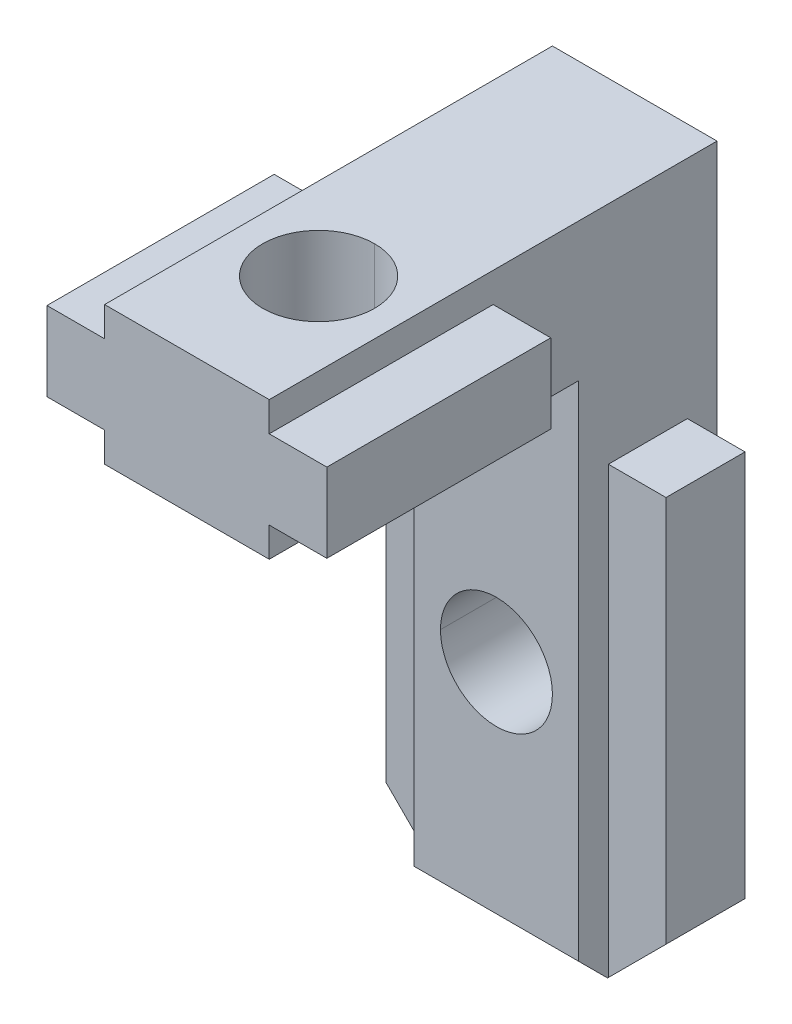
ISO-10303-21;
HEADER;
FILE_DESCRIPTION(('STEP AP214'),'2;1');
FILE_NAME('part.step','',(''),(''),'','','');
FILE_SCHEMA(('AUTOMOTIVE_DESIGN { 1 0 10303 214 1 1 1 1 }'));
ENDSEC;
DATA;
#1=APPLICATION_CONTEXT('core data for automotive mechanical design processes');
#2=APPLICATION_PROTOCOL_DEFINITION('international standard','automotive_design',2000,#1);
#3=PRODUCT_CONTEXT('',#1,'mechanical');
#4=PRODUCT('Part','Part','',(#3));
#5=PRODUCT_RELATED_PRODUCT_CATEGORY('part','',(#4));
#6=PRODUCT_DEFINITION_FORMATION('','',#4);
#7=PRODUCT_DEFINITION_CONTEXT('part definition',#1,'design');
#8=PRODUCT_DEFINITION('design','',#6,#7);
#9=PRODUCT_DEFINITION_SHAPE('','',#8);
#10=(LENGTH_UNIT() NAMED_UNIT(*) SI_UNIT(.MILLI.,.METRE.));
#11=(NAMED_UNIT(*) PLANE_ANGLE_UNIT() SI_UNIT($,.RADIAN.));
#12=(NAMED_UNIT(*) SI_UNIT($,.STERADIAN.) SOLID_ANGLE_UNIT());
#13=UNCERTAINTY_MEASURE_WITH_UNIT(LENGTH_MEASURE(1.E-05),#10,'distance_accuracy_value','');
#14=(GEOMETRIC_REPRESENTATION_CONTEXT(3) GLOBAL_UNCERTAINTY_ASSIGNED_CONTEXT((#13)) GLOBAL_UNIT_ASSIGNED_CONTEXT((#10,
#11,#12)) REPRESENTATION_CONTEXT('',''));
#15=CARTESIAN_POINT('',(0.,0.,0.));
#16=DIRECTION('',(0.,0.,1.));
#17=DIRECTION('',(1.,0.,0.));
#18=AXIS2_PLACEMENT_3D('',#15,#16,#17);
#19=CARTESIAN_POINT('',(-5.,15.,8.4));
#20=DIRECTION('',(0.,0.,1.));
#21=DIRECTION('',(1.,0.,0.));
#22=AXIS2_PLACEMENT_3D('',#19,#20,#21);
#23=CYLINDRICAL_SURFACE('',#22,3.4);
#24=DIRECTION('',(0.,0.,1.));
#25=VECTOR('',#24,1.);
#26=CARTESIAN_POINT('',(-8.4,15.,8.4));
#27=LINE('',#26,#25);
#28=CARTESIAN_POINT('',(-8.4,15.,0.));
#29=VERTEX_POINT('',#28);
#30=CARTESIAN_POINT('',(-8.4,15.,8.4));
#31=VERTEX_POINT('',#30);
#32=EDGE_CURVE('E599',#29,#31,#27,.T.);
#33=ORIENTED_EDGE('',*,*,#32,.F.);
#34=CARTESIAN_POINT('',(-5.,15.,0.));
#35=DIRECTION('',(0.,0.,1.));
#36=DIRECTION('',(1.,0.,0.));
#37=AXIS2_PLACEMENT_3D('',#34,#35,#36);
#38=CIRCLE('',#37,3.4);
#39=CARTESIAN_POINT('',(-1.6,15.,0.));
#40=VERTEX_POINT('',#39);
#41=EDGE_CURVE('E397',#40,#29,#38,.T.);
#42=ORIENTED_EDGE('',*,*,#41,.F.);
#43=DIRECTION('',(0.,0.,1.));
#44=VECTOR('',#43,1.);
#45=CARTESIAN_POINT('',(-1.6,15.,8.4));
#46=LINE('',#45,#44);
#47=CARTESIAN_POINT('',(-1.6,15.,8.4));
#48=VERTEX_POINT('',#47);
#49=EDGE_CURVE('E610',#40,#48,#46,.T.);
#50=ORIENTED_EDGE('',*,*,#49,.T.);
#51=CARTESIAN_POINT('',(-5.,15.,8.4));
#52=DIRECTION('',(0.,0.,1.));
#53=DIRECTION('',(1.,0.,0.));
#54=AXIS2_PLACEMENT_3D('',#51,#52,#53);
#55=CIRCLE('',#54,3.4);
#56=EDGE_CURVE('E398',#48,#31,#55,.T.);
#57=ORIENTED_EDGE('',*,*,#56,.T.);
#58=EDGE_LOOP('',(#33,#42,#50,#57));
#59=FACE_BOUND('',#58,.T.);
#60=ADVANCED_FACE('F17',(#59),#23,.F.);
#61=CARTESIAN_POINT('',(-5.,32.3,19.2));
#62=DIRECTION('',(0.,-1.,0.));
#63=DIRECTION('',(0.,0.,-1.));
#64=AXIS2_PLACEMENT_3D('',#61,#62,#63);
#65=CYLINDRICAL_SURFACE('',#64,3.4);
#66=DIRECTION('',(0.,-1.,0.));
#67=VECTOR('',#66,1.);
#68=CARTESIAN_POINT('',(-5.,32.3,22.6));
#69=LINE('',#68,#67);
#70=CARTESIAN_POINT('',(-5.,40.7,22.6));
#71=VERTEX_POINT('',#70);
#72=CARTESIAN_POINT('',(-5.,32.3,22.6));
#73=VERTEX_POINT('',#72);
#74=EDGE_CURVE('E598',#71,#73,#69,.T.);
#75=ORIENTED_EDGE('',*,*,#74,.F.);
#76=CARTESIAN_POINT('',(-5.,40.7,19.2));
#77=DIRECTION('',(0.,-1.,0.));
#78=DIRECTION('',(0.,0.,-1.));
#79=AXIS2_PLACEMENT_3D('',#76,#77,#78);
#80=CIRCLE('',#79,3.4);
#81=CARTESIAN_POINT('',(-5.,40.7,15.8));
#82=VERTEX_POINT('',#81);
#83=EDGE_CURVE('E379',#82,#71,#80,.T.);
#84=ORIENTED_EDGE('',*,*,#83,.F.);
#85=DIRECTION('',(0.,-1.,0.));
#86=VECTOR('',#85,1.);
#87=CARTESIAN_POINT('',(-5.,32.3,15.8));
#88=LINE('',#87,#86);
#89=CARTESIAN_POINT('',(-5.,32.3,15.8));
#90=VERTEX_POINT('',#89);
#91=EDGE_CURVE('E584',#82,#90,#88,.T.);
#92=ORIENTED_EDGE('',*,*,#91,.T.);
#93=CARTESIAN_POINT('',(-5.,32.3,19.2));
#94=DIRECTION('',(0.,-1.,0.));
#95=DIRECTION('',(0.,0.,-1.));
#96=AXIS2_PLACEMENT_3D('',#93,#94,#95);
#97=CIRCLE('',#96,3.4);
#98=EDGE_CURVE('E410',#90,#73,#97,.T.);
#99=ORIENTED_EDGE('',*,*,#98,.T.);
#100=EDGE_LOOP('',(#75,#84,#92,#99));
#101=FACE_BOUND('',#100,.T.);
#102=ADVANCED_FACE('F19',(#101),#65,.F.);
#103=CARTESIAN_POINT('',(0.,1.75,8.4));
#104=DIRECTION('',(0.,-0.707106781186549,0.707106781186546));
#105=DIRECTION('',(-1.,0.,0.));
#106=AXIS2_PLACEMENT_3D('',#103,#104,#105);
#107=PLANE('',#106);
#108=DIRECTION('',(0.,0.707106781186546,0.707106781186549));
#109=VECTOR('',#108,1.);
#110=CARTESIAN_POINT('',(-10.,1.75,8.4));
#111=LINE('',#110,#109);
#112=CARTESIAN_POINT('',(-10.,0.,6.65));
#113=VERTEX_POINT('',#112);
#114=CARTESIAN_POINT('',(-10.,1.75,8.4));
#115=VERTEX_POINT('',#114);
#116=EDGE_CURVE('E511',#113,#115,#111,.T.);
#117=ORIENTED_EDGE('',*,*,#116,.F.);
#118=DIRECTION('',(-1.,0.,0.));
#119=VECTOR('',#118,1.);
#120=CARTESIAN_POINT('',(-10.,0.,6.65));
#121=LINE('',#120,#119);
#122=CARTESIAN_POINT('',(0.,0.,6.65));
#123=VERTEX_POINT('',#122);
#124=EDGE_CURVE('E290',#123,#113,#121,.T.);
#125=ORIENTED_EDGE('',*,*,#124,.F.);
#126=DIRECTION('',(0.,-0.707106781186546,-0.707106781186549));
#127=VECTOR('',#126,1.);
#128=CARTESIAN_POINT('',(0.,1.75,8.4));
#129=LINE('',#128,#127);
#130=CARTESIAN_POINT('',(0.,1.75,8.4));
#131=VERTEX_POINT('',#130);
#132=EDGE_CURVE('E362',#131,#123,#129,.T.);
#133=ORIENTED_EDGE('',*,*,#132,.F.);
#134=DIRECTION('',(1.,0.,0.));
#135=VECTOR('',#134,1.);
#136=CARTESIAN_POINT('',(0.,1.75,8.4));
#137=LINE('',#136,#135);
#138=EDGE_CURVE('E386',#115,#131,#137,.T.);
#139=ORIENTED_EDGE('',*,*,#138,.F.);
#140=EDGE_LOOP('',(#117,#125,#133,#139));
#141=FACE_BOUND('',#140,.T.);
#142=ADVANCED_FACE('F1128',(#141),#107,.T.);
#143=CARTESIAN_POINT('',(0.,0.,1.75));
#144=DIRECTION('',(0.,0.707106781186546,0.707106781186549));
#145=DIRECTION('',(1.,0.,0.));
#146=AXIS2_PLACEMENT_3D('',#143,#144,#145);
#147=PLANE('',#146);
#148=DIRECTION('',(0.,-0.707106781186549,0.707106781186546));
#149=VECTOR('',#148,1.);
#150=CARTESIAN_POINT('',(-10.,0.,1.75));
#151=LINE('',#150,#149);
#152=CARTESIAN_POINT('',(-10.,1.75,0.));
#153=VERTEX_POINT('',#152);
#154=CARTESIAN_POINT('',(-10.,0.,1.75));
#155=VERTEX_POINT('',#154);
#156=EDGE_CURVE('E559',#153,#155,#151,.T.);
#157=ORIENTED_EDGE('',*,*,#156,.F.);
#158=DIRECTION('',(-1.,0.,0.));
#159=VECTOR('',#158,1.);
#160=CARTESIAN_POINT('',(0.,1.75,0.));
#161=LINE('',#160,#159);
#162=CARTESIAN_POINT('',(0.,1.75,0.));
#163=VERTEX_POINT('',#162);
#164=EDGE_CURVE('E394',#163,#153,#161,.T.);
#165=ORIENTED_EDGE('',*,*,#164,.F.);
#166=DIRECTION('',(0.,0.707106781186549,-0.707106781186546));
#167=VECTOR('',#166,1.);
#168=CARTESIAN_POINT('',(0.,0.,1.75));
#169=LINE('',#168,#167);
#170=CARTESIAN_POINT('',(0.,0.,1.75));
#171=VERTEX_POINT('',#170);
#172=EDGE_CURVE('E308',#171,#163,#169,.T.);
#173=ORIENTED_EDGE('',*,*,#172,.F.);
#174=DIRECTION('',(1.,0.,0.));
#175=VECTOR('',#174,1.);
#176=CARTESIAN_POINT('',(0.,0.,1.75));
#177=LINE('',#176,#175);
#178=EDGE_CURVE('E291',#155,#171,#177,.T.);
#179=ORIENTED_EDGE('',*,*,#178,.F.);
#180=EDGE_LOOP('',(#157,#165,#173,#179));
#181=FACE_BOUND('',#180,.T.);
#182=ADVANCED_FACE('F1120',(#181),#147,.F.);
#183=CARTESIAN_POINT('',(3.5,3.5,6.6));
#184=DIRECTION('',(-0.707106781186546,0.707106781186549,0.));
#185=DIRECTION('',(0.,0.,1.));
#186=AXIS2_PLACEMENT_3D('',#183,#184,#185);
#187=PLANE('',#186);
#188=DIRECTION('',(0.707106781186549,0.707106781186546,0.));
#189=VECTOR('',#188,1.);
#190=CARTESIAN_POINT('',(3.5,3.5,6.6));
#191=LINE('',#190,#189);
#192=CARTESIAN_POINT('',(0.,0.,6.6));
#193=VERTEX_POINT('',#192);
#194=CARTESIAN_POINT('',(3.5,3.5,6.6));
#195=VERTEX_POINT('',#194);
#196=EDGE_CURVE('E284',#193,#195,#191,.T.);
#197=ORIENTED_EDGE('',*,*,#196,.F.);
#198=DIRECTION('',(0.,0.,1.));
#199=VECTOR('',#198,1.);
#200=CARTESIAN_POINT('',(0.,0.,8.4));
#201=LINE('',#200,#199);
#202=CARTESIAN_POINT('',(0.,0.,1.8));
#203=VERTEX_POINT('',#202);
#204=EDGE_CURVE('E281',#203,#193,#201,.T.);
#205=ORIENTED_EDGE('',*,*,#204,.F.);
#206=DIRECTION('',(-0.707106781186549,-0.707106781186546,0.));
#207=VECTOR('',#206,1.);
#208=CARTESIAN_POINT('',(3.5,3.5,1.8));
#209=LINE('',#208,#207);
#210=CARTESIAN_POINT('',(3.5,3.5,1.8));
#211=VERTEX_POINT('',#210);
#212=EDGE_CURVE('E267',#211,#203,#209,.T.);
#213=ORIENTED_EDGE('',*,*,#212,.F.);
#214=DIRECTION('',(0.,0.,-1.));
#215=VECTOR('',#214,1.);
#216=CARTESIAN_POINT('',(3.5,3.5,6.6));
#217=LINE('',#216,#215);
#218=EDGE_CURVE('E406',#195,#211,#217,.T.);
#219=ORIENTED_EDGE('',*,*,#218,.F.);
#220=EDGE_LOOP('',(#197,#205,#213,#219));
#221=FACE_BOUND('',#220,.T.);
#222=ADVANCED_FACE('F282',(#221),#187,.F.);
#223=CARTESIAN_POINT('',(-13.5,3.5,1.8));
#224=DIRECTION('',(-0.707106781186546,-0.707106781186549,0.));
#225=DIRECTION('',(-0.707106781186549,0.707106781186546,0.));
#226=AXIS2_PLACEMENT_3D('',#223,#224,#225);
#227=PLANE('',#226);
#228=DIRECTION('',(-0.707106781186549,0.707106781186546,0.));
#229=VECTOR('',#228,1.);
#230=CARTESIAN_POINT('',(-13.5,3.5,1.8));
#231=LINE('',#230,#229);
#232=CARTESIAN_POINT('',(-10.,0.,1.8));
#233=VERTEX_POINT('',#232);
#234=CARTESIAN_POINT('',(-13.5,3.5,1.8));
#235=VERTEX_POINT('',#234);
#236=EDGE_CURVE('E366',#233,#235,#231,.T.);
#237=ORIENTED_EDGE('',*,*,#236,.F.);
#238=DIRECTION('',(0.,0.,-1.));
#239=VECTOR('',#238,1.);
#240=CARTESIAN_POINT('',(-10.,0.,1.8));
#241=LINE('',#240,#239);
#242=CARTESIAN_POINT('',(-10.,0.,6.6));
#243=VERTEX_POINT('',#242);
#244=EDGE_CURVE('E382',#243,#233,#241,.T.);
#245=ORIENTED_EDGE('',*,*,#244,.F.);
#246=DIRECTION('',(0.707106781186549,-0.707106781186546,0.));
#247=VECTOR('',#246,1.);
#248=CARTESIAN_POINT('',(-13.5,3.5,6.6));
#249=LINE('',#248,#247);
#250=CARTESIAN_POINT('',(-13.5,3.5,6.6));
#251=VERTEX_POINT('',#250);
#252=EDGE_CURVE('E473',#251,#243,#249,.T.);
#253=ORIENTED_EDGE('',*,*,#252,.F.);
#254=DIRECTION('',(0.,0.,1.));
#255=VECTOR('',#254,1.);
#256=CARTESIAN_POINT('',(-13.5,3.5,6.6));
#257=LINE('',#256,#255);
#258=EDGE_CURVE('E11',#235,#251,#257,.T.);
#259=ORIENTED_EDGE('',*,*,#258,.F.);
#260=EDGE_LOOP('',(#237,#245,#253,#259));
#261=FACE_BOUND('',#260,.T.);
#262=ADVANCED_FACE('F1097',(#261),#227,.T.);
#263=CARTESIAN_POINT('',(-13.5,0.,1.8));
#264=DIRECTION('',(-1.,0.,0.));
#265=DIRECTION('',(0.,0.,1.));
#266=AXIS2_PLACEMENT_3D('',#263,#264,#265);
#267=PLANE('',#266);
#268=DIRECTION('',(0.,-1.,0.));
#269=VECTOR('',#268,1.);
#270=CARTESIAN_POINT('',(-13.5,27.,1.8));
#271=LINE('',#270,#269);
#272=CARTESIAN_POINT('',(-13.5,27.,1.8));
#273=VERTEX_POINT('',#272);
#274=EDGE_CURVE('E399',#273,#235,#271,.T.);
#275=ORIENTED_EDGE('',*,*,#274,.T.);
#276=ORIENTED_EDGE('',*,*,#258,.T.);
#277=DIRECTION('',(0.,1.,0.));
#278=VECTOR('',#277,1.);
#279=CARTESIAN_POINT('',(-13.5,27.,6.6));
#280=LINE('',#279,#278);
#281=CARTESIAN_POINT('',(-13.5,27.,6.6));
#282=VERTEX_POINT('',#281);
#283=EDGE_CURVE('E470',#251,#282,#280,.T.);
#284=ORIENTED_EDGE('',*,*,#283,.T.);
#285=DIRECTION('',(0.,0.,-1.));
#286=VECTOR('',#285,1.);
#287=CARTESIAN_POINT('',(-13.5,27.,1.8));
#288=LINE('',#287,#286);
#289=EDGE_CURVE('E26',#282,#273,#288,.T.);
#290=ORIENTED_EDGE('',*,*,#289,.T.);
#291=EDGE_LOOP('',(#275,#276,#284,#290));
#292=FACE_BOUND('',#291,.T.);
#293=ADVANCED_FACE('F1089',(#292),#267,.T.);
#294=CARTESIAN_POINT('',(-13.5,27.,1.8));
#295=DIRECTION('',(0.,-1.,0.));
#296=DIRECTION('',(0.,0.,-1.));
#297=AXIS2_PLACEMENT_3D('',#294,#295,#296);
#298=PLANE('',#297);
#299=DIRECTION('',(0.,0.,-1.));
#300=VECTOR('',#299,1.);
#301=CARTESIAN_POINT('',(-10.,27.,1.8));
#302=LINE('',#301,#300);
#303=CARTESIAN_POINT('',(-10.,27.,6.6));
#304=VERTEX_POINT('',#303);
#305=CARTESIAN_POINT('',(-10.,27.,1.8));
#306=VERTEX_POINT('',#305);
#307=EDGE_CURVE('E482',#304,#306,#302,.T.);
#308=ORIENTED_EDGE('',*,*,#307,.T.);
#309=DIRECTION('',(1.,0.,0.));
#310=VECTOR('',#309,1.);
#311=CARTESIAN_POINT('',(-13.5,27.,1.8));
#312=LINE('',#311,#310);
#313=EDGE_CURVE('E402',#273,#306,#312,.T.);
#314=ORIENTED_EDGE('',*,*,#313,.F.);
#315=ORIENTED_EDGE('',*,*,#289,.F.);
#316=DIRECTION('',(1.,0.,0.));
#317=VECTOR('',#316,1.);
#318=CARTESIAN_POINT('',(-13.5,27.,6.6));
#319=LINE('',#318,#317);
#320=EDGE_CURVE('E376',#282,#304,#319,.T.);
#321=ORIENTED_EDGE('',*,*,#320,.T.);
#322=EDGE_LOOP('',(#308,#314,#315,#321));
#323=FACE_BOUND('',#322,.T.);
#324=ADVANCED_FACE('F480',(#323),#298,.F.);
#325=CARTESIAN_POINT('',(-13.5,27.,6.6));
#326=DIRECTION('',(0.,0.,-1.));
#327=DIRECTION('',(0.,-1.,0.));
#328=AXIS2_PLACEMENT_3D('',#325,#326,#327);
#329=PLANE('',#328);
#330=ORIENTED_EDGE('',*,*,#283,.F.);
#331=ORIENTED_EDGE('',*,*,#252,.T.);
#332=DIRECTION('',(0.,1.,0.));
#333=VECTOR('',#332,1.);
#334=CARTESIAN_POINT('',(-10.,27.,6.6));
#335=LINE('',#334,#333);
#336=EDGE_CURVE('E487',#243,#304,#335,.T.);
#337=ORIENTED_EDGE('',*,*,#336,.T.);
#338=ORIENTED_EDGE('',*,*,#320,.F.);
#339=EDGE_LOOP('',(#330,#331,#337,#338));
#340=FACE_BOUND('',#339,.T.);
#341=ADVANCED_FACE('F488',(#340),#329,.F.);
#342=CARTESIAN_POINT('',(-13.5,27.,1.8));
#343=DIRECTION('',(0.,0.,1.));
#344=DIRECTION('',(0.,-1.,0.));
#345=AXIS2_PLACEMENT_3D('',#342,#343,#344);
#346=PLANE('',#345);
#347=DIRECTION('',(0.,-1.,0.));
#348=VECTOR('',#347,1.);
#349=CARTESIAN_POINT('',(-10.,27.,1.8));
#350=LINE('',#349,#348);
#351=EDGE_CURVE('E499',#306,#233,#350,.T.);
#352=ORIENTED_EDGE('',*,*,#351,.T.);
#353=ORIENTED_EDGE('',*,*,#236,.T.);
#354=ORIENTED_EDGE('',*,*,#274,.F.);
#355=ORIENTED_EDGE('',*,*,#313,.T.);
#356=EDGE_LOOP('',(#352,#353,#354,#355));
#357=FACE_BOUND('',#356,.T.);
#358=ADVANCED_FACE('F924',(#357),#346,.F.);
#359=CARTESIAN_POINT('',(-13.5,34.1,27.2));
#360=DIRECTION('',(1.,0.,0.));
#361=DIRECTION('',(0.,1.,0.));
#362=AXIS2_PLACEMENT_3D('',#359,#360,#361);
#363=PLANE('',#362);
#364=DIRECTION('',(0.,1.,0.));
#365=VECTOR('',#364,1.);
#366=CARTESIAN_POINT('',(-13.5,38.9,27.2));
#367=LINE('',#366,#365);
#368=CARTESIAN_POINT('',(-13.5,34.1,27.2));
#369=VERTEX_POINT('',#368);
#370=CARTESIAN_POINT('',(-13.5,38.9,27.2));
#371=VERTEX_POINT('',#370);
#372=EDGE_CURVE('E416',#369,#371,#367,.T.);
#373=ORIENTED_EDGE('',*,*,#372,.T.);
#374=DIRECTION('',(0.,0.,-1.));
#375=VECTOR('',#374,1.);
#376=CARTESIAN_POINT('',(-13.5,38.9,27.2));
#377=LINE('',#376,#375);
#378=CARTESIAN_POINT('',(-13.5,38.9,13.4));
#379=VERTEX_POINT('',#378);
#380=EDGE_CURVE('E431',#371,#379,#377,.T.);
#381=ORIENTED_EDGE('',*,*,#380,.T.);
#382=DIRECTION('',(0.,-1.,0.));
#383=VECTOR('',#382,1.);
#384=CARTESIAN_POINT('',(-13.5,38.9,13.4));
#385=LINE('',#384,#383);
#386=CARTESIAN_POINT('',(-13.5,34.1,13.4));
#387=VERTEX_POINT('',#386);
#388=EDGE_CURVE('E367',#379,#387,#385,.T.);
#389=ORIENTED_EDGE('',*,*,#388,.T.);
#390=DIRECTION('',(0.,0.,1.));
#391=VECTOR('',#390,1.);
#392=CARTESIAN_POINT('',(-13.5,34.1,27.2));
#393=LINE('',#392,#391);
#394=EDGE_CURVE('E363',#387,#369,#393,.T.);
#395=ORIENTED_EDGE('',*,*,#394,.T.);
#396=EDGE_LOOP('',(#373,#381,#389,#395));
#397=FACE_BOUND('',#396,.T.);
#398=ADVANCED_FACE('F919',(#397),#363,.F.);
#399=CARTESIAN_POINT('',(-13.5,34.1,27.2));
#400=DIRECTION('',(0.,1.,0.));
#401=DIRECTION('',(0.,0.,-1.));
#402=AXIS2_PLACEMENT_3D('',#399,#400,#401);
#403=PLANE('',#402);
#404=DIRECTION('',(0.,0.,1.));
#405=VECTOR('',#404,1.);
#406=CARTESIAN_POINT('',(-10.,34.1,27.2));
#407=LINE('',#406,#405);
#408=CARTESIAN_POINT('',(-10.,34.1,13.4));
#409=VERTEX_POINT('',#408);
#410=CARTESIAN_POINT('',(-10.,34.1,27.2));
#411=VERTEX_POINT('',#410);
#412=EDGE_CURVE('E529',#409,#411,#407,.T.);
#413=ORIENTED_EDGE('',*,*,#412,.T.);
#414=DIRECTION('',(1.,0.,0.));
#415=VECTOR('',#414,1.);
#416=CARTESIAN_POINT('',(-13.5,34.1,27.2));
#417=LINE('',#416,#415);
#418=EDGE_CURVE('E417',#369,#411,#417,.T.);
#419=ORIENTED_EDGE('',*,*,#418,.F.);
#420=ORIENTED_EDGE('',*,*,#394,.F.);
#421=DIRECTION('',(1.,0.,0.));
#422=VECTOR('',#421,1.);
#423=CARTESIAN_POINT('',(-13.5,34.1,13.4));
#424=LINE('',#423,#422);
#425=EDGE_CURVE('E428',#387,#409,#424,.T.);
#426=ORIENTED_EDGE('',*,*,#425,.T.);
#427=EDGE_LOOP('',(#413,#419,#420,#426));
#428=FACE_BOUND('',#427,.T.);
#429=ADVANCED_FACE('F923',(#428),#403,.F.);
#430=CARTESIAN_POINT('',(-13.5,38.9,13.4));
#431=DIRECTION('',(0.,0.,1.));
#432=DIRECTION('',(0.,-1.,0.));
#433=AXIS2_PLACEMENT_3D('',#430,#431,#432);
#434=PLANE('',#433);
#435=DIRECTION('',(0.,-1.,0.));
#436=VECTOR('',#435,1.);
#437=CARTESIAN_POINT('',(-10.,38.9,13.4));
#438=LINE('',#437,#436);
#439=CARTESIAN_POINT('',(-10.,38.9,13.4));
#440=VERTEX_POINT('',#439);
#441=EDGE_CURVE('E533',#440,#409,#438,.T.);
#442=ORIENTED_EDGE('',*,*,#441,.T.);
#443=ORIENTED_EDGE('',*,*,#425,.F.);
#444=ORIENTED_EDGE('',*,*,#388,.F.);
#445=DIRECTION('',(1.,0.,0.));
#446=VECTOR('',#445,1.);
#447=CARTESIAN_POINT('',(-13.5,38.9,13.4));
#448=LINE('',#447,#446);
#449=EDGE_CURVE('E456',#379,#440,#448,.T.);
#450=ORIENTED_EDGE('',*,*,#449,.T.);
#451=EDGE_LOOP('',(#442,#443,#444,#450));
#452=FACE_BOUND('',#451,.T.);
#453=ADVANCED_FACE('F1050',(#452),#434,.F.);
#454=CARTESIAN_POINT('',(-13.5,38.9,27.2));
#455=DIRECTION('',(0.,-1.,0.));
#456=DIRECTION('',(0.,0.,-1.));
#457=AXIS2_PLACEMENT_3D('',#454,#455,#456);
#458=PLANE('',#457);
#459=DIRECTION('',(0.,0.,-1.));
#460=VECTOR('',#459,1.);
#461=CARTESIAN_POINT('',(-10.,38.9,27.2));
#462=LINE('',#461,#460);
#463=CARTESIAN_POINT('',(-10.,38.9,27.2));
#464=VERTEX_POINT('',#463);
#465=EDGE_CURVE('E540',#464,#440,#462,.T.);
#466=ORIENTED_EDGE('',*,*,#465,.T.);
#467=ORIENTED_EDGE('',*,*,#449,.F.);
#468=ORIENTED_EDGE('',*,*,#380,.F.);
#469=DIRECTION('',(1.,0.,0.));
#470=VECTOR('',#469,1.);
#471=CARTESIAN_POINT('',(-13.5,38.9,27.2));
#472=LINE('',#471,#470);
#473=EDGE_CURVE('E413',#371,#464,#472,.T.);
#474=ORIENTED_EDGE('',*,*,#473,.T.);
#475=EDGE_LOOP('',(#466,#467,#468,#474));
#476=FACE_BOUND('',#475,.T.);
#477=ADVANCED_FACE('F1041',(#476),#458,.F.);
#478=CARTESIAN_POINT('',(3.5,27.,6.6));
#479=DIRECTION('',(-1.,0.,0.));
#480=DIRECTION('',(0.,0.,1.));
#481=AXIS2_PLACEMENT_3D('',#478,#479,#480);
#482=PLANE('',#481);
#483=DIRECTION('',(0.,-1.,0.));
#484=VECTOR('',#483,1.);
#485=CARTESIAN_POINT('',(3.5,0.,6.6));
#486=LINE('',#485,#484);
#487=CARTESIAN_POINT('',(3.5,27.,6.6));
#488=VERTEX_POINT('',#487);
#489=EDGE_CURVE('E443',#488,#195,#486,.T.);
#490=ORIENTED_EDGE('',*,*,#489,.T.);
#491=ORIENTED_EDGE('',*,*,#218,.T.);
#492=DIRECTION('',(0.,1.,0.));
#493=VECTOR('',#492,1.);
#494=CARTESIAN_POINT('',(3.5,0.,1.8));
#495=LINE('',#494,#493);
#496=CARTESIAN_POINT('',(3.5,27.,1.8));
#497=VERTEX_POINT('',#496);
#498=EDGE_CURVE('E275',#211,#497,#495,.T.);
#499=ORIENTED_EDGE('',*,*,#498,.T.);
#500=DIRECTION('',(0.,0.,1.));
#501=VECTOR('',#500,1.);
#502=CARTESIAN_POINT('',(3.5,27.,6.6));
#503=LINE('',#502,#501);
#504=EDGE_CURVE('E403',#497,#488,#503,.T.);
#505=ORIENTED_EDGE('',*,*,#504,.T.);
#506=EDGE_LOOP('',(#490,#491,#499,#505));
#507=FACE_BOUND('',#506,.T.);
#508=ADVANCED_FACE('F993',(#507),#482,.F.);
#509=CARTESIAN_POINT('',(3.5,27.,6.6));
#510=DIRECTION('',(0.,-1.,0.));
#511=DIRECTION('',(0.,0.,-1.));
#512=AXIS2_PLACEMENT_3D('',#509,#510,#511);
#513=PLANE('',#512);
#514=DIRECTION('',(0.,0.,1.));
#515=VECTOR('',#514,1.);
#516=CARTESIAN_POINT('',(0.,27.,6.6));
#517=LINE('',#516,#515);
#518=CARTESIAN_POINT('',(0.,27.,1.8));
#519=VERTEX_POINT('',#518);
#520=CARTESIAN_POINT('',(0.,27.,6.6));
#521=VERTEX_POINT('',#520);
#522=EDGE_CURVE('E300',#519,#521,#517,.T.);
#523=ORIENTED_EDGE('',*,*,#522,.T.);
#524=DIRECTION('',(-1.,0.,0.));
#525=VECTOR('',#524,1.);
#526=CARTESIAN_POINT('',(3.5,27.,6.6));
#527=LINE('',#526,#525);
#528=EDGE_CURVE('E447',#488,#521,#527,.T.);
#529=ORIENTED_EDGE('',*,*,#528,.F.);
#530=ORIENTED_EDGE('',*,*,#504,.F.);
#531=DIRECTION('',(-1.,0.,0.));
#532=VECTOR('',#531,1.);
#533=CARTESIAN_POINT('',(3.5,27.,1.8));
#534=LINE('',#533,#532);
#535=EDGE_CURVE('E278',#497,#519,#534,.T.);
#536=ORIENTED_EDGE('',*,*,#535,.T.);
#537=EDGE_LOOP('',(#523,#529,#530,#536));
#538=FACE_BOUND('',#537,.T.);
#539=ADVANCED_FACE('F989',(#538),#513,.F.);
#540=CARTESIAN_POINT('',(3.5,0.,1.8));
#541=DIRECTION('',(0.,0.,1.));
#542=DIRECTION('',(0.,-1.,0.));
#543=AXIS2_PLACEMENT_3D('',#540,#541,#542);
#544=PLANE('',#543);
#545=ORIENTED_EDGE('',*,*,#498,.F.);
#546=ORIENTED_EDGE('',*,*,#212,.T.);
#547=DIRECTION('',(0.,1.,0.));
#548=VECTOR('',#547,1.);
#549=CARTESIAN_POINT('',(0.,0.,1.8));
#550=LINE('',#549,#548);
#551=EDGE_CURVE('E272',#203,#519,#550,.T.);
#552=ORIENTED_EDGE('',*,*,#551,.T.);
#553=ORIENTED_EDGE('',*,*,#535,.F.);
#554=EDGE_LOOP('',(#545,#546,#552,#553));
#555=FACE_BOUND('',#554,.T.);
#556=ADVANCED_FACE('F269',(#555),#544,.F.);
#557=CARTESIAN_POINT('',(3.5,0.,6.6));
#558=DIRECTION('',(0.,0.,-1.));
#559=DIRECTION('',(0.,-1.,0.));
#560=AXIS2_PLACEMENT_3D('',#557,#558,#559);
#561=PLANE('',#560);
#562=DIRECTION('',(0.,-1.,0.));
#563=VECTOR('',#562,1.);
#564=CARTESIAN_POINT('',(0.,0.,6.6));
#565=LINE('',#564,#563);
#566=EDGE_CURVE('E368',#521,#193,#565,.T.);
#567=ORIENTED_EDGE('',*,*,#566,.T.);
#568=ORIENTED_EDGE('',*,*,#196,.T.);
#569=ORIENTED_EDGE('',*,*,#489,.F.);
#570=ORIENTED_EDGE('',*,*,#528,.T.);
#571=EDGE_LOOP('',(#567,#568,#569,#570));
#572=FACE_BOUND('',#571,.T.);
#573=ADVANCED_FACE('F886',(#572),#561,.F.);
#574=CARTESIAN_POINT('',(3.5,34.1,27.2));
#575=DIRECTION('',(1.,0.,0.));
#576=DIRECTION('',(0.,1.,0.));
#577=AXIS2_PLACEMENT_3D('',#574,#575,#576);
#578=PLANE('',#577);
#579=DIRECTION('',(0.,-1.,0.));
#580=VECTOR('',#579,1.);
#581=CARTESIAN_POINT('',(3.5,38.9,27.2));
#582=LINE('',#581,#580);
#583=CARTESIAN_POINT('',(3.5,38.9,27.2));
#584=VERTEX_POINT('',#583);
#585=CARTESIAN_POINT('',(3.5,34.1,27.2));
#586=VERTEX_POINT('',#585);
#587=EDGE_CURVE('E333',#584,#586,#582,.T.);
#588=ORIENTED_EDGE('',*,*,#587,.T.);
#589=DIRECTION('',(0.,0.,-1.));
#590=VECTOR('',#589,1.);
#591=CARTESIAN_POINT('',(3.5,34.1,27.2));
#592=LINE('',#591,#590);
#593=CARTESIAN_POINT('',(3.5,34.1,13.6));
#594=VERTEX_POINT('',#593);
#595=EDGE_CURVE('E327',#586,#594,#592,.T.);
#596=ORIENTED_EDGE('',*,*,#595,.T.);
#597=DIRECTION('',(0.,1.,0.));
#598=VECTOR('',#597,1.);
#599=CARTESIAN_POINT('',(3.5,38.9,13.6));
#600=LINE('',#599,#598);
#601=CARTESIAN_POINT('',(3.5,38.9,13.6));
#602=VERTEX_POINT('',#601);
#603=EDGE_CURVE('E434',#594,#602,#600,.T.);
#604=ORIENTED_EDGE('',*,*,#603,.T.);
#605=DIRECTION('',(0.,0.,1.));
#606=VECTOR('',#605,1.);
#607=CARTESIAN_POINT('',(3.5,38.9,27.2));
#608=LINE('',#607,#606);
#609=EDGE_CURVE('E438',#602,#584,#608,.T.);
#610=ORIENTED_EDGE('',*,*,#609,.T.);
#611=EDGE_LOOP('',(#588,#596,#604,#610));
#612=FACE_BOUND('',#611,.T.);
#613=ADVANCED_FACE('F890',(#612),#578,.T.);
#614=CARTESIAN_POINT('',(3.5,38.9,27.2));
#615=DIRECTION('',(0.,-1.,0.));
#616=DIRECTION('',(0.,0.,-1.));
#617=AXIS2_PLACEMENT_3D('',#614,#615,#616);
#618=PLANE('',#617);
#619=DIRECTION('',(0.,0.,1.));
#620=VECTOR('',#619,1.);
#621=CARTESIAN_POINT('',(0.,38.9,27.2));
#622=LINE('',#621,#620);
#623=CARTESIAN_POINT('',(0.,38.9,13.6));
#624=VERTEX_POINT('',#623);
#625=CARTESIAN_POINT('',(0.,38.9,27.2));
#626=VERTEX_POINT('',#625);
#627=EDGE_CURVE('E322',#624,#626,#622,.T.);
#628=ORIENTED_EDGE('',*,*,#627,.T.);
#629=DIRECTION('',(-1.,0.,0.));
#630=VECTOR('',#629,1.);
#631=CARTESIAN_POINT('',(3.5,38.9,27.2));
#632=LINE('',#631,#630);
#633=EDGE_CURVE('E328',#584,#626,#632,.T.);
#634=ORIENTED_EDGE('',*,*,#633,.F.);
#635=ORIENTED_EDGE('',*,*,#609,.F.);
#636=DIRECTION('',(-1.,0.,0.));
#637=VECTOR('',#636,1.);
#638=CARTESIAN_POINT('',(3.5,38.9,13.6));
#639=LINE('',#638,#637);
#640=EDGE_CURVE('E423',#602,#624,#639,.T.);
#641=ORIENTED_EDGE('',*,*,#640,.T.);
#642=EDGE_LOOP('',(#628,#634,#635,#641));
#643=FACE_BOUND('',#642,.T.);
#644=ADVANCED_FACE('F950',(#643),#618,.F.);
#645=CARTESIAN_POINT('',(3.5,38.9,13.6));
#646=DIRECTION('',(0.,0.,1.));
#647=DIRECTION('',(0.,-1.,0.));
#648=AXIS2_PLACEMENT_3D('',#645,#646,#647);
#649=PLANE('',#648);
#650=DIRECTION('',(0.,1.,0.));
#651=VECTOR('',#650,1.);
#652=CARTESIAN_POINT('',(0.,38.9,13.6));
#653=LINE('',#652,#651);
#654=CARTESIAN_POINT('',(0.,34.1,13.6));
#655=VERTEX_POINT('',#654);
#656=EDGE_CURVE('E342',#655,#624,#653,.T.);
#657=ORIENTED_EDGE('',*,*,#656,.T.);
#658=ORIENTED_EDGE('',*,*,#640,.F.);
#659=ORIENTED_EDGE('',*,*,#603,.F.);
#660=DIRECTION('',(-1.,0.,0.));
#661=VECTOR('',#660,1.);
#662=CARTESIAN_POINT('',(3.5,34.1,13.6));
#663=LINE('',#662,#661);
#664=EDGE_CURVE('E324',#594,#655,#663,.T.);
#665=ORIENTED_EDGE('',*,*,#664,.T.);
#666=EDGE_LOOP('',(#657,#658,#659,#665));
#667=FACE_BOUND('',#666,.T.);
#668=ADVANCED_FACE('F945',(#667),#649,.F.);
#669=CARTESIAN_POINT('',(3.5,34.1,27.2));
#670=DIRECTION('',(0.,1.,0.));
#671=DIRECTION('',(1.,0.,0.));
#672=AXIS2_PLACEMENT_3D('',#669,#670,#671);
#673=PLANE('',#672);
#674=DIRECTION('',(0.,0.,-1.));
#675=VECTOR('',#674,1.);
#676=CARTESIAN_POINT('',(0.,34.1,27.2));
#677=LINE('',#676,#675);
#678=CARTESIAN_POINT('',(0.,34.1,27.2));
#679=VERTEX_POINT('',#678);
#680=EDGE_CURVE('E346',#679,#655,#677,.T.);
#681=ORIENTED_EDGE('',*,*,#680,.T.);
#682=ORIENTED_EDGE('',*,*,#664,.F.);
#683=ORIENTED_EDGE('',*,*,#595,.F.);
#684=DIRECTION('',(-1.,0.,0.));
#685=VECTOR('',#684,1.);
#686=CARTESIAN_POINT('',(3.5,34.1,27.2));
#687=LINE('',#686,#685);
#688=EDGE_CURVE('E337',#586,#679,#687,.T.);
#689=ORIENTED_EDGE('',*,*,#688,.T.);
#690=EDGE_LOOP('',(#681,#682,#683,#689));
#691=FACE_BOUND('',#690,.T.);
#692=ADVANCED_FACE('F949',(#691),#673,.F.);
#693=CARTESIAN_POINT('',(0.,32.3,27.2));
#694=DIRECTION('',(0.,0.,-1.));
#695=DIRECTION('',(0.,-1.,0.));
#696=AXIS2_PLACEMENT_3D('',#693,#694,#695);
#697=PLANE('',#696);
#698=DIRECTION('',(0.,-1.,0.));
#699=VECTOR('',#698,1.);
#700=CARTESIAN_POINT('',(0.,40.7,27.2));
#701=LINE('',#700,#699);
#702=CARTESIAN_POINT('',(0.,40.7,27.2));
#703=VERTEX_POINT('',#702);
#704=EDGE_CURVE('E338',#703,#626,#701,.T.);
#705=ORIENTED_EDGE('',*,*,#704,.F.);
#706=DIRECTION('',(1.,0.,0.));
#707=VECTOR('',#706,1.);
#708=CARTESIAN_POINT('',(0.,40.7,27.2));
#709=LINE('',#708,#707);
#710=CARTESIAN_POINT('',(-10.,40.7,27.2));
#711=VERTEX_POINT('',#710);
#712=EDGE_CURVE('E354',#711,#703,#709,.T.);
#713=ORIENTED_EDGE('',*,*,#712,.F.);
#714=DIRECTION('',(0.,1.,0.));
#715=VECTOR('',#714,1.);
#716=CARTESIAN_POINT('',(-10.,40.7,27.2));
#717=LINE('',#716,#715);
#718=EDGE_CURVE('E319',#464,#711,#717,.T.);
#719=ORIENTED_EDGE('',*,*,#718,.F.);
#720=ORIENTED_EDGE('',*,*,#473,.F.);
#721=ORIENTED_EDGE('',*,*,#372,.F.);
#722=ORIENTED_EDGE('',*,*,#418,.T.);
#723=DIRECTION('',(0.,1.,0.));
#724=VECTOR('',#723,1.);
#725=CARTESIAN_POINT('',(-10.,40.7,27.2));
#726=LINE('',#725,#724);
#727=CARTESIAN_POINT('',(-10.,32.3,27.2));
#728=VERTEX_POINT('',#727);
#729=EDGE_CURVE('E524',#728,#411,#726,.T.);
#730=ORIENTED_EDGE('',*,*,#729,.F.);
#731=DIRECTION('',(-1.,0.,0.));
#732=VECTOR('',#731,1.);
#733=CARTESIAN_POINT('',(0.,32.3,27.2));
#734=LINE('',#733,#732);
#735=CARTESIAN_POINT('',(0.,32.3,27.2));
#736=VERTEX_POINT('',#735);
#737=EDGE_CURVE('E407',#736,#728,#734,.T.);
#738=ORIENTED_EDGE('',*,*,#737,.F.);
#739=DIRECTION('',(0.,-1.,0.));
#740=VECTOR('',#739,1.);
#741=CARTESIAN_POINT('',(0.,40.7,27.2));
#742=LINE('',#741,#740);
#743=EDGE_CURVE('E347',#679,#736,#742,.T.);
#744=ORIENTED_EDGE('',*,*,#743,.F.);
#745=ORIENTED_EDGE('',*,*,#688,.F.);
#746=ORIENTED_EDGE('',*,*,#587,.F.);
#747=ORIENTED_EDGE('',*,*,#633,.T.);
#748=EDGE_LOOP('',(#705,#713,#719,#720,#721,#722,#730,#738,#744,#745,#746,#747));
#749=FACE_BOUND('',#748,.T.);
#750=ADVANCED_FACE('F983',(#749),#697,.F.);
#751=CARTESIAN_POINT('',(0.,32.3,27.2));
#752=DIRECTION('',(0.,-1.,0.));
#753=DIRECTION('',(0.,0.,-1.));
#754=AXIS2_PLACEMENT_3D('',#751,#752,#753);
#755=PLANE('',#754);
#756=ORIENTED_EDGE('',*,*,#98,.F.);
#757=CARTESIAN_POINT('',(-5.,32.3,19.2));
#758=DIRECTION('',(0.,-1.,0.));
#759=DIRECTION('',(0.,0.,-1.));
#760=AXIS2_PLACEMENT_3D('',#757,#758,#759);
#761=CIRCLE('',#760,3.4);
#762=EDGE_CURVE('E592',#73,#90,#761,.T.);
#763=ORIENTED_EDGE('',*,*,#762,.F.);
#764=EDGE_LOOP('',(#756,#763));
#765=FACE_BOUND('',#764,.T.);
#766=DIRECTION('',(0.,0.,-1.));
#767=VECTOR('',#766,1.);
#768=CARTESIAN_POINT('',(-10.,32.3,27.2));
#769=LINE('',#768,#767);
#770=CARTESIAN_POINT('',(-10.,32.3,8.4));
#771=VERTEX_POINT('',#770);
#772=EDGE_CURVE('E521',#728,#771,#769,.T.);
#773=ORIENTED_EDGE('',*,*,#772,.T.);
#774=DIRECTION('',(1.,0.,0.));
#775=VECTOR('',#774,1.);
#776=CARTESIAN_POINT('',(0.,32.3,8.4));
#777=LINE('',#776,#775);
#778=CARTESIAN_POINT('',(0.,32.3,8.4));
#779=VERTEX_POINT('',#778);
#780=EDGE_CURVE('E393',#771,#779,#777,.T.);
#781=ORIENTED_EDGE('',*,*,#780,.T.);
#782=DIRECTION('',(0.,0.,-1.));
#783=VECTOR('',#782,1.);
#784=CARTESIAN_POINT('',(0.,32.3,27.2));
#785=LINE('',#784,#783);
#786=EDGE_CURVE('E351',#736,#779,#785,.T.);
#787=ORIENTED_EDGE('',*,*,#786,.F.);
#788=ORIENTED_EDGE('',*,*,#737,.T.);
#789=EDGE_LOOP('',(#773,#781,#787,#788));
#790=FACE_BOUND('',#789,.T.);
#791=ADVANCED_FACE('F975',(#765,#790),#755,.T.);
#792=CARTESIAN_POINT('',(0.,40.7,0.));
#793=DIRECTION('',(0.,0.,1.));
#794=DIRECTION('',(1.,0.,0.));
#795=AXIS2_PLACEMENT_3D('',#792,#793,#794);
#796=PLANE('',#795);
#797=ORIENTED_EDGE('',*,*,#41,.T.);
#798=CARTESIAN_POINT('',(-5.,15.,0.));
#799=DIRECTION('',(0.,0.,1.));
#800=DIRECTION('',(1.,0.,0.));
#801=AXIS2_PLACEMENT_3D('',#798,#799,#800);
#802=CIRCLE('',#801,3.4);
#803=EDGE_CURVE('E595',#29,#40,#802,.T.);
#804=ORIENTED_EDGE('',*,*,#803,.T.);
#805=EDGE_LOOP('',(#797,#804));
#806=FACE_BOUND('',#805,.T.);
#807=DIRECTION('',(0.,1.,0.));
#808=VECTOR('',#807,1.);
#809=CARTESIAN_POINT('',(0.,0.,0.));
#810=LINE('',#809,#808);
#811=CARTESIAN_POINT('',(0.,40.7,0.));
#812=VERTEX_POINT('',#811);
#813=EDGE_CURVE('E315',#163,#812,#810,.T.);
#814=ORIENTED_EDGE('',*,*,#813,.F.);
#815=ORIENTED_EDGE('',*,*,#164,.T.);
#816=DIRECTION('',(0.,-1.,0.));
#817=VECTOR('',#816,1.);
#818=CARTESIAN_POINT('',(-10.,0.,0.));
#819=LINE('',#818,#817);
#820=CARTESIAN_POINT('',(-10.,40.7,0.));
#821=VERTEX_POINT('',#820);
#822=EDGE_CURVE('E581',#821,#153,#819,.T.);
#823=ORIENTED_EDGE('',*,*,#822,.F.);
#824=DIRECTION('',(-1.,0.,0.));
#825=VECTOR('',#824,1.);
#826=CARTESIAN_POINT('',(0.,40.7,0.));
#827=LINE('',#826,#825);
#828=EDGE_CURVE('E302',#812,#821,#827,.T.);
#829=ORIENTED_EDGE('',*,*,#828,.F.);
#830=EDGE_LOOP('',(#814,#815,#823,#829));
#831=FACE_BOUND('',#830,.T.);
#832=ADVANCED_FACE('F578',(#806,#831),#796,.F.);
#833=CARTESIAN_POINT('',(0.,40.7,8.4));
#834=DIRECTION('',(0.,0.,1.));
#835=DIRECTION('',(1.,0.,0.));
#836=AXIS2_PLACEMENT_3D('',#833,#834,#835);
#837=PLANE('',#836);
#838=ORIENTED_EDGE('',*,*,#56,.F.);
#839=CARTESIAN_POINT('',(-5.,15.,8.4));
#840=DIRECTION('',(0.,0.,1.));
#841=DIRECTION('',(1.,0.,0.));
#842=AXIS2_PLACEMENT_3D('',#839,#840,#841);
#843=CIRCLE('',#842,3.4);
#844=EDGE_CURVE('E603',#31,#48,#843,.T.);
#845=ORIENTED_EDGE('',*,*,#844,.F.);
#846=EDGE_LOOP('',(#838,#845));
#847=FACE_BOUND('',#846,.T.);
#848=DIRECTION('',(0.,-1.,0.));
#849=VECTOR('',#848,1.);
#850=CARTESIAN_POINT('',(-10.,0.,8.4));
#851=LINE('',#850,#849);
#852=EDGE_CURVE('E514',#771,#115,#851,.T.);
#853=ORIENTED_EDGE('',*,*,#852,.T.);
#854=ORIENTED_EDGE('',*,*,#138,.T.);
#855=DIRECTION('',(0.,1.,0.));
#856=VECTOR('',#855,1.);
#857=CARTESIAN_POINT('',(0.,0.,8.4));
#858=LINE('',#857,#856);
#859=EDGE_CURVE('E358',#131,#779,#858,.T.);
#860=ORIENTED_EDGE('',*,*,#859,.T.);
#861=ORIENTED_EDGE('',*,*,#780,.F.);
#862=EDGE_LOOP('',(#853,#854,#860,#861));
#863=FACE_BOUND('',#862,.T.);
#864=ADVANCED_FACE('F959',(#847,#863),#837,.T.);
#865=CARTESIAN_POINT('',(0.,0.,8.4));
#866=DIRECTION('',(0.,1.,0.));
#867=DIRECTION('',(1.,0.,0.));
#868=AXIS2_PLACEMENT_3D('',#865,#866,#867);
#869=PLANE('',#868);
#870=DIRECTION('',(0.,0.,-1.));
#871=VECTOR('',#870,1.);
#872=CARTESIAN_POINT('',(-10.,0.,8.4));
#873=LINE('',#872,#871);
#874=EDGE_CURVE('E507',#233,#155,#873,.T.);
#875=ORIENTED_EDGE('',*,*,#874,.T.);
#876=ORIENTED_EDGE('',*,*,#178,.T.);
#877=DIRECTION('',(0.,0.,-1.));
#878=VECTOR('',#877,1.);
#879=CARTESIAN_POINT('',(0.,0.,8.4));
#880=LINE('',#879,#878);
#881=EDGE_CURVE('E297',#203,#171,#880,.T.);
#882=ORIENTED_EDGE('',*,*,#881,.F.);
#883=ORIENTED_EDGE('',*,*,#204,.T.);
#884=DIRECTION('',(0.,0.,-1.));
#885=VECTOR('',#884,1.);
#886=CARTESIAN_POINT('',(0.,0.,8.4));
#887=LINE('',#886,#885);
#888=EDGE_CURVE('E371',#123,#193,#887,.T.);
#889=ORIENTED_EDGE('',*,*,#888,.F.);
#890=ORIENTED_EDGE('',*,*,#124,.T.);
#891=DIRECTION('',(0.,0.,-1.));
#892=VECTOR('',#891,1.);
#893=CARTESIAN_POINT('',(-10.,0.,8.4));
#894=LINE('',#893,#892);
#895=EDGE_CURVE('E493',#113,#243,#894,.T.);
#896=ORIENTED_EDGE('',*,*,#895,.T.);
#897=ORIENTED_EDGE('',*,*,#244,.T.);
#898=EDGE_LOOP('',(#875,#876,#882,#883,#889,#890,#896,#897));
#899=FACE_BOUND('',#898,.T.);
#900=ADVANCED_FACE('F305',(#899),#869,.F.);
#901=CARTESIAN_POINT('',(0.,40.7,8.4));
#902=DIRECTION('',(0.,-1.,0.));
#903=DIRECTION('',(0.,0.,-1.));
#904=AXIS2_PLACEMENT_3D('',#901,#902,#903);
#905=PLANE('',#904);
#906=ORIENTED_EDGE('',*,*,#83,.T.);
#907=CARTESIAN_POINT('',(-5.,40.7,19.2));
#908=DIRECTION('',(0.,-1.,0.));
#909=DIRECTION('',(0.,0.,-1.));
#910=AXIS2_PLACEMENT_3D('',#907,#908,#909);
#911=CIRCLE('',#910,3.4);
#912=EDGE_CURVE('E614',#71,#82,#911,.T.);
#913=ORIENTED_EDGE('',*,*,#912,.T.);
#914=EDGE_LOOP('',(#906,#913));
#915=FACE_BOUND('',#914,.T.);
#916=ORIENTED_EDGE('',*,*,#828,.T.);
#917=DIRECTION('',(0.,0.,-1.));
#918=VECTOR('',#917,1.);
#919=CARTESIAN_POINT('',(-10.,40.7,8.4));
#920=LINE('',#919,#918);
#921=EDGE_CURVE('E309',#711,#821,#920,.T.);
#922=ORIENTED_EDGE('',*,*,#921,.F.);
#923=ORIENTED_EDGE('',*,*,#712,.T.);
#924=DIRECTION('',(0.,0.,-1.));
#925=VECTOR('',#924,1.);
#926=CARTESIAN_POINT('',(0.,40.7,8.4));
#927=LINE('',#926,#925);
#928=EDGE_CURVE('E332',#703,#812,#927,.T.);
#929=ORIENTED_EDGE('',*,*,#928,.T.);
#930=EDGE_LOOP('',(#916,#922,#923,#929));
#931=FACE_BOUND('',#930,.T.);
#932=ADVANCED_FACE('F573',(#915,#931),#905,.F.);
#933=CARTESIAN_POINT('',(0.,0.,8.4));
#934=DIRECTION('',(-1.,0.,0.));
#935=DIRECTION('',(0.,0.,1.));
#936=AXIS2_PLACEMENT_3D('',#933,#934,#935);
#937=PLANE('',#936);
#938=ORIENTED_EDGE('',*,*,#881,.T.);
#939=ORIENTED_EDGE('',*,*,#172,.T.);
#940=ORIENTED_EDGE('',*,*,#813,.T.);
#941=ORIENTED_EDGE('',*,*,#928,.F.);
#942=ORIENTED_EDGE('',*,*,#704,.T.);
#943=ORIENTED_EDGE('',*,*,#627,.F.);
#944=ORIENTED_EDGE('',*,*,#656,.F.);
#945=ORIENTED_EDGE('',*,*,#680,.F.);
#946=ORIENTED_EDGE('',*,*,#743,.T.);
#947=ORIENTED_EDGE('',*,*,#786,.T.);
#948=ORIENTED_EDGE('',*,*,#859,.F.);
#949=ORIENTED_EDGE('',*,*,#132,.T.);
#950=ORIENTED_EDGE('',*,*,#888,.T.);
#951=ORIENTED_EDGE('',*,*,#566,.F.);
#952=ORIENTED_EDGE('',*,*,#522,.F.);
#953=ORIENTED_EDGE('',*,*,#551,.F.);
#954=EDGE_LOOP('',(#938,#939,#940,#941,#942,#943,#944,#945,#946,#947,#948,#949,#950,#951,#952,#953));
#955=FACE_BOUND('',#954,.T.);
#956=ADVANCED_FACE('F295',(#955),#937,.F.);
#957=CARTESIAN_POINT('',(-10.,0.,8.4));
#958=DIRECTION('',(1.,0.,0.));
#959=DIRECTION('',(0.,1.,0.));
#960=AXIS2_PLACEMENT_3D('',#957,#958,#959);
#961=PLANE('',#960);
#962=ORIENTED_EDGE('',*,*,#822,.T.);
#963=ORIENTED_EDGE('',*,*,#156,.T.);
#964=ORIENTED_EDGE('',*,*,#874,.F.);
#965=ORIENTED_EDGE('',*,*,#351,.F.);
#966=ORIENTED_EDGE('',*,*,#307,.F.);
#967=ORIENTED_EDGE('',*,*,#336,.F.);
#968=ORIENTED_EDGE('',*,*,#895,.F.);
#969=ORIENTED_EDGE('',*,*,#116,.T.);
#970=ORIENTED_EDGE('',*,*,#852,.F.);
#971=ORIENTED_EDGE('',*,*,#772,.F.);
#972=ORIENTED_EDGE('',*,*,#729,.T.);
#973=ORIENTED_EDGE('',*,*,#412,.F.);
#974=ORIENTED_EDGE('',*,*,#441,.F.);
#975=ORIENTED_EDGE('',*,*,#465,.F.);
#976=ORIENTED_EDGE('',*,*,#718,.T.);
#977=ORIENTED_EDGE('',*,*,#921,.T.);
#978=EDGE_LOOP('',(#962,#963,#964,#965,#966,#967,#968,#969,#970,#971,#972,#973,#974,#975,#976,#977));
#979=FACE_BOUND('',#978,.T.);
#980=ADVANCED_FACE('F496',(#979),#961,.F.);
#981=CARTESIAN_POINT('',(-5.,32.3,19.2));
#982=DIRECTION('',(0.,-1.,0.));
#983=DIRECTION('',(0.,0.,-1.));
#984=AXIS2_PLACEMENT_3D('',#981,#982,#983);
#985=CYLINDRICAL_SURFACE('',#984,3.4);
#986=ORIENTED_EDGE('',*,*,#912,.F.);
#987=ORIENTED_EDGE('',*,*,#74,.T.);
#988=ORIENTED_EDGE('',*,*,#762,.T.);
#989=ORIENTED_EDGE('',*,*,#91,.F.);
#990=EDGE_LOOP('',(#986,#987,#988,#989));
#991=FACE_BOUND('',#990,.T.);
#992=ADVANCED_FACE('F906',(#991),#985,.F.);
#993=CARTESIAN_POINT('',(-5.,15.,8.4));
#994=DIRECTION('',(0.,0.,1.));
#995=DIRECTION('',(1.,0.,0.));
#996=AXIS2_PLACEMENT_3D('',#993,#994,#995);
#997=CYLINDRICAL_SURFACE('',#996,3.4);
#998=ORIENTED_EDGE('',*,*,#803,.F.);
#999=ORIENTED_EDGE('',*,*,#32,.T.);
#1000=ORIENTED_EDGE('',*,*,#844,.T.);
#1001=ORIENTED_EDGE('',*,*,#49,.F.);
#1002=EDGE_LOOP('',(#998,#999,#1000,#1001));
#1003=FACE_BOUND('',#1002,.T.);
#1004=ADVANCED_FACE('F634',(#1003),#997,.F.);
#1005=CLOSED_SHELL('',(#60,#102,#142,#182,#222,#262,#293,#324,#341,#358,#398,#429,#453,#477,
#508,#539,#556,#573,#613,#644,#668,#692,#750,#791,#832,#864,#900,#932,#956,#980,#992,#1004));
#1006=MANIFOLD_SOLID_BREP('B1',#1005);
#1007=ADVANCED_BREP_SHAPE_REPRESENTATION('',(#18,#1006),#14);
#1008=SHAPE_DEFINITION_REPRESENTATION(#9,#1007);
ENDSEC;
END-ISO-10303-21;
